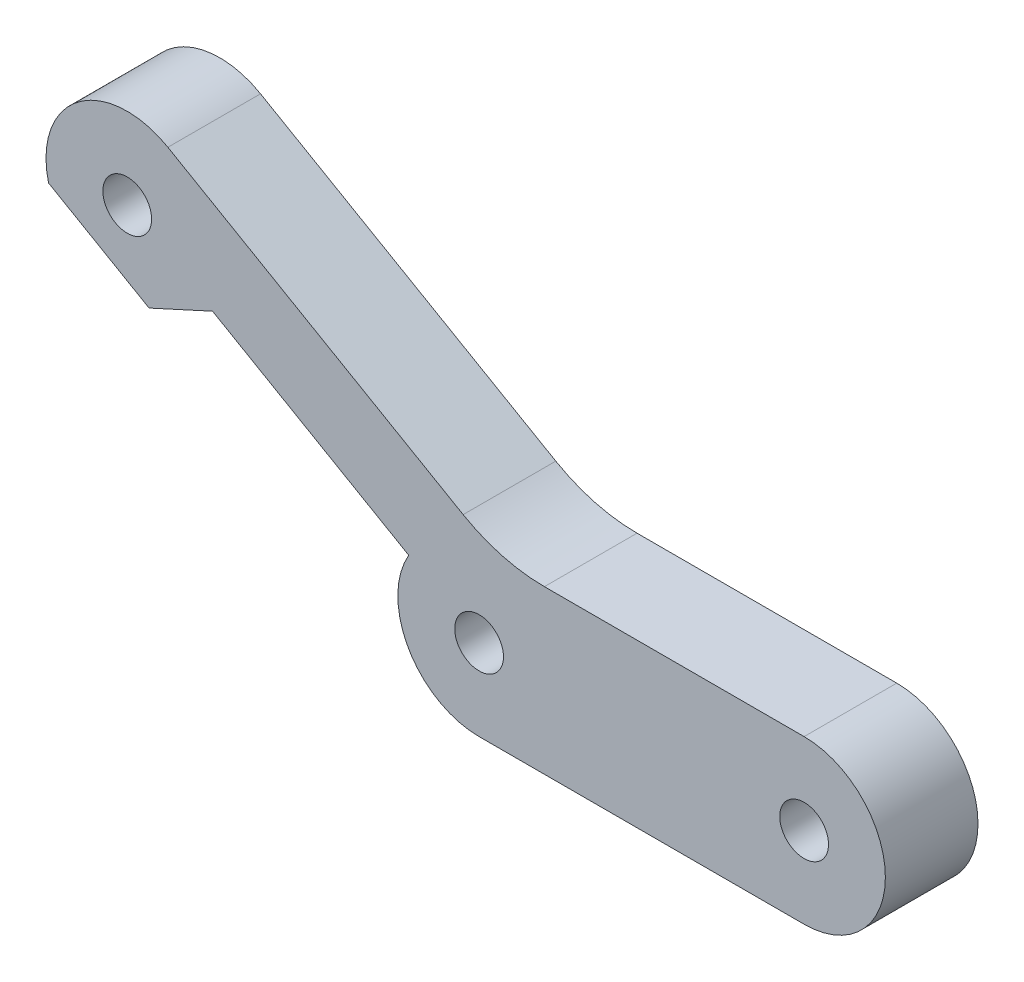
ISO-10303-21;
HEADER;
FILE_DESCRIPTION(('STEP AP214'),'2;1');
FILE_NAME('part.step','',(''),(''),'','','');
FILE_SCHEMA(('AUTOMOTIVE_DESIGN { 1 0 10303 214 1 1 1 1 }'));
ENDSEC;
DATA;
#1=APPLICATION_CONTEXT('core data for automotive mechanical design processes');
#2=APPLICATION_PROTOCOL_DEFINITION('international standard','automotive_design',2000,#1);
#3=PRODUCT_CONTEXT('',#1,'mechanical');
#4=PRODUCT('Part','Part','',(#3));
#5=PRODUCT_RELATED_PRODUCT_CATEGORY('part','',(#4));
#6=PRODUCT_DEFINITION_FORMATION('','',#4);
#7=PRODUCT_DEFINITION_CONTEXT('part definition',#1,'design');
#8=PRODUCT_DEFINITION('design','',#6,#7);
#9=PRODUCT_DEFINITION_SHAPE('','',#8);
#10=(LENGTH_UNIT() NAMED_UNIT(*) SI_UNIT(.MILLI.,.METRE.));
#11=(NAMED_UNIT(*) PLANE_ANGLE_UNIT() SI_UNIT($,.RADIAN.));
#12=(NAMED_UNIT(*) SI_UNIT($,.STERADIAN.) SOLID_ANGLE_UNIT());
#13=UNCERTAINTY_MEASURE_WITH_UNIT(LENGTH_MEASURE(1.E-05),#10,'distance_accuracy_value','');
#14=(GEOMETRIC_REPRESENTATION_CONTEXT(3) GLOBAL_UNCERTAINTY_ASSIGNED_CONTEXT((#13)) GLOBAL_UNIT_ASSIGNED_CONTEXT((#10,
#11,#12)) REPRESENTATION_CONTEXT('',''));
#15=CARTESIAN_POINT('',(0.,0.,0.));
#16=DIRECTION('',(0.,0.,1.));
#17=DIRECTION('',(1.,0.,0.));
#18=AXIS2_PLACEMENT_3D('',#15,#16,#17);
#19=CARTESIAN_POINT('',(0.,5.,5.7));
#20=DIRECTION('',(0.,1.,0.));
#21=DIRECTION('',(-1.,0.,0.));
#22=AXIS2_PLACEMENT_3D('',#19,#20,#21);
#23=PLANE('',#22);
#24=DIRECTION('',(1.,0.,0.));
#25=VECTOR('',#24,1.);
#26=CARTESIAN_POINT('',(0.,5.,0.));
#27=LINE('',#26,#25);
#28=CARTESIAN_POINT('',(-5.98076211353317,5.,0.));
#29=VERTEX_POINT('',#28);
#30=CARTESIAN_POINT('',(10.,5.,0.));
#31=VERTEX_POINT('',#30);
#32=EDGE_CURVE('E168',#29,#31,#27,.T.);
#33=ORIENTED_EDGE('',*,*,#32,.F.);
#34=DIRECTION('',(0.,0.,-1.));
#35=VECTOR('',#34,1.);
#36=CARTESIAN_POINT('',(-5.98076211353317,5.,5.7));
#37=LINE('',#36,#35);
#38=CARTESIAN_POINT('',(-5.98076211353317,5.,5.7));
#39=VERTEX_POINT('',#38);
#40=EDGE_CURVE('E11',#39,#29,#37,.T.);
#41=ORIENTED_EDGE('',*,*,#40,.F.);
#42=DIRECTION('',(1.,0.,0.));
#43=VECTOR('',#42,1.);
#44=CARTESIAN_POINT('',(0.,5.,5.7));
#45=LINE('',#44,#43);
#46=CARTESIAN_POINT('',(10.,5.,5.7));
#47=VERTEX_POINT('',#46);
#48=EDGE_CURVE('E262',#39,#47,#45,.T.);
#49=ORIENTED_EDGE('',*,*,#48,.T.);
#50=DIRECTION('',(0.,0.,-1.));
#51=VECTOR('',#50,1.);
#52=CARTESIAN_POINT('',(10.,5.,5.7));
#53=LINE('',#52,#51);
#54=EDGE_CURVE('E93',#47,#31,#53,.T.);
#55=ORIENTED_EDGE('',*,*,#54,.T.);
#56=EDGE_LOOP('',(#33,#41,#49,#55));
#57=FACE_BOUND('',#56,.T.);
#58=ADVANCED_FACE('F36',(#57),#23,.T.);
#59=CARTESIAN_POINT('',(-5.98076211353321,15.,5.7));
#60=DIRECTION('',(0.,0.,-1.));
#61=DIRECTION('',(-1.,0.,0.));
#62=AXIS2_PLACEMENT_3D('',#59,#60,#61);
#63=CYLINDRICAL_SURFACE('',#62,10.);
#64=CARTESIAN_POINT('',(-5.98076211353321,15.,0.));
#65=DIRECTION('',(0.,0.,1.));
#66=DIRECTION('',(1.,0.,0.));
#67=AXIS2_PLACEMENT_3D('',#64,#65,#66);
#68=CIRCLE('',#67,10.);
#69=CARTESIAN_POINT('',(-10.9807621135332,6.33974596215554,0.));
#70=VERTEX_POINT('',#69);
#71=EDGE_CURVE('E166',#29,#70,#68,.F.);
#72=ORIENTED_EDGE('',*,*,#71,.T.);
#73=DIRECTION('',(0.,0.,-1.));
#74=VECTOR('',#73,1.);
#75=CARTESIAN_POINT('',(-10.9807621135332,6.33974596215554,5.7));
#76=LINE('',#75,#74);
#77=CARTESIAN_POINT('',(-10.9807621135332,6.33974596215554,5.7));
#78=VERTEX_POINT('',#77);
#79=EDGE_CURVE('E45',#78,#70,#76,.T.);
#80=ORIENTED_EDGE('',*,*,#79,.F.);
#81=CARTESIAN_POINT('',(-5.98076211353321,15.,5.7));
#82=DIRECTION('',(0.,0.,1.));
#83=DIRECTION('',(1.,0.,0.));
#84=AXIS2_PLACEMENT_3D('',#81,#82,#83);
#85=CIRCLE('',#84,10.);
#86=EDGE_CURVE('E264',#39,#78,#85,.F.);
#87=ORIENTED_EDGE('',*,*,#86,.F.);
#88=ORIENTED_EDGE('',*,*,#40,.T.);
#89=EDGE_LOOP('',(#72,#80,#87,#88));
#90=FACE_BOUND('',#89,.T.);
#91=ADVANCED_FACE('F167',(#90),#63,.F.);
#92=CARTESIAN_POINT('',(0.,0.,5.7));
#93=DIRECTION('',(-0.499999999999995,-0.866025403784441,0.));
#94=DIRECTION('',(0.866025403784442,-0.499999999999995,0.));
#95=AXIS2_PLACEMENT_3D('',#92,#93,#94);
#96=PLANE('',#95);
#97=DIRECTION('',(-0.866025403784442,0.499999999999995,0.));
#98=VECTOR('',#97,1.);
#99=CARTESIAN_POINT('',(0.,0.,0.));
#100=LINE('',#99,#98);
#101=CARTESIAN_POINT('',(-29.1506350946111,16.830127018922,0.));
#102=VERTEX_POINT('',#101);
#103=EDGE_CURVE('E160',#70,#102,#100,.T.);
#104=ORIENTED_EDGE('',*,*,#103,.T.);
#105=DIRECTION('',(0.,0.,-1.));
#106=VECTOR('',#105,1.);
#107=CARTESIAN_POINT('',(-29.1506350946111,16.830127018922,5.7));
#108=LINE('',#107,#106);
#109=CARTESIAN_POINT('',(-29.1506350946111,16.830127018922,5.7));
#110=VERTEX_POINT('',#109);
#111=EDGE_CURVE('E151',#110,#102,#108,.T.);
#112=ORIENTED_EDGE('',*,*,#111,.F.);
#113=DIRECTION('',(-0.866025403784442,0.499999999999995,0.));
#114=VECTOR('',#113,1.);
#115=CARTESIAN_POINT('',(0.,0.,5.7));
#116=LINE('',#115,#114);
#117=EDGE_CURVE('E162',#78,#110,#116,.T.);
#118=ORIENTED_EDGE('',*,*,#117,.F.);
#119=ORIENTED_EDGE('',*,*,#79,.T.);
#120=EDGE_LOOP('',(#104,#112,#118,#119));
#121=FACE_BOUND('',#120,.T.);
#122=ADVANCED_FACE('F158',(#121),#96,.F.);
#123=CARTESIAN_POINT('',(-31.650635094611,12.4999999999999,5.7));
#124=DIRECTION('',(0.,0.,-1.));
#125=DIRECTION('',(-1.,0.,0.));
#126=AXIS2_PLACEMENT_3D('',#123,#124,#125);
#127=CYLINDRICAL_SURFACE('',#126,5.00000000000001);
#128=CARTESIAN_POINT('',(-31.650635094611,12.4999999999999,0.));
#129=DIRECTION('',(0.,0.,1.));
#130=DIRECTION('',(1.,0.,0.));
#131=AXIS2_PLACEMENT_3D('',#128,#129,#130);
#132=CIRCLE('',#131,5.00000000000001);
#133=CARTESIAN_POINT('',(-36.4929643138243,11.25426819389,0.));
#134=VERTEX_POINT('',#133);
#135=EDGE_CURVE('E170',#102,#134,#132,.T.);
#136=ORIENTED_EDGE('',*,*,#135,.T.);
#137=DIRECTION('',(0.,0.,-1.));
#138=VECTOR('',#137,1.);
#139=CARTESIAN_POINT('',(-36.4929643138243,11.25426819389,5.7));
#140=LINE('',#139,#138);
#141=CARTESIAN_POINT('',(-36.4929643138243,11.25426819389,5.7));
#142=VERTEX_POINT('',#141);
#143=EDGE_CURVE('E149',#142,#134,#140,.T.);
#144=ORIENTED_EDGE('',*,*,#143,.F.);
#145=CARTESIAN_POINT('',(-31.650635094611,12.4999999999999,5.7));
#146=DIRECTION('',(0.,0.,1.));
#147=DIRECTION('',(1.,0.,0.));
#148=AXIS2_PLACEMENT_3D('',#145,#146,#147);
#149=CIRCLE('',#148,5.00000000000001);
#150=EDGE_CURVE('E271',#110,#142,#149,.T.);
#151=ORIENTED_EDGE('',*,*,#150,.F.);
#152=ORIENTED_EDGE('',*,*,#111,.T.);
#153=EDGE_LOOP('',(#136,#144,#151,#152));
#154=FACE_BOUND('',#153,.T.);
#155=ADVANCED_FACE('F224',(#154),#127,.T.);
#156=CARTESIAN_POINT('',(-4.25,-7.36121593216778,5.7));
#157=DIRECTION('',(-0.499999999999997,-0.86602540378444,0.));
#158=DIRECTION('',(0.86602540378444,-0.499999999999997,0.));
#159=AXIS2_PLACEMENT_3D('',#156,#157,#158);
#160=PLANE('',#159);
#161=DIRECTION('',(-0.86602540378444,0.499999999999997,0.));
#162=VECTOR('',#161,1.);
#163=CARTESIAN_POINT('',(-4.25,-7.36121593216778,0.));
#164=LINE('',#163,#162);
#165=CARTESIAN_POINT('',(-30.3083058753978,7.68355397961862,0.));
#166=VERTEX_POINT('',#165);
#167=EDGE_CURVE('E178',#166,#134,#164,.T.);
#168=ORIENTED_EDGE('',*,*,#167,.F.);
#169=DIRECTION('',(0.,0.,-1.));
#170=VECTOR('',#169,1.);
#171=CARTESIAN_POINT('',(-30.3083058753978,7.68355397961862,5.7));
#172=LINE('',#171,#170);
#173=CARTESIAN_POINT('',(-30.3083058753978,7.68355397961862,5.7));
#174=VERTEX_POINT('',#173);
#175=EDGE_CURVE('E147',#174,#166,#172,.T.);
#176=ORIENTED_EDGE('',*,*,#175,.F.);
#177=DIRECTION('',(-0.86602540378444,0.499999999999997,0.));
#178=VECTOR('',#177,1.);
#179=CARTESIAN_POINT('',(-4.25,-7.36121593216778,5.7));
#180=LINE('',#179,#178);
#181=EDGE_CURVE('E273',#174,#142,#180,.T.);
#182=ORIENTED_EDGE('',*,*,#181,.T.);
#183=ORIENTED_EDGE('',*,*,#143,.T.);
#184=EDGE_LOOP('',(#168,#176,#182,#183));
#185=FACE_BOUND('',#184,.T.);
#186=ADVANCED_FACE('F227',(#185),#160,.T.);
#187=CARTESIAN_POINT('',(-8.13835034975614,17.8126794569233,5.7));
#188=DIRECTION('',(-0.415565936172885,0.909563055919024,0.));
#189=DIRECTION('',(-0.909563055919024,-0.415565936172885,0.));
#190=AXIS2_PLACEMENT_3D('',#187,#188,#189);
#191=PLANE('',#190);
#192=DIRECTION('',(0.909563055919024,0.415565936172885,0.));
#193=VECTOR('',#192,1.);
#194=CARTESIAN_POINT('',(-8.13835034975614,17.8126794569233,0.));
#195=LINE('',#194,#193);
#196=CARTESIAN_POINT('',(-26.400635094611,9.46891108675433,0.));
#197=VERTEX_POINT('',#196);
#198=EDGE_CURVE('E181',#166,#197,#195,.T.);
#199=ORIENTED_EDGE('',*,*,#198,.T.);
#200=DIRECTION('',(0.,0.,-1.));
#201=VECTOR('',#200,1.);
#202=CARTESIAN_POINT('',(-26.400635094611,9.46891108675433,5.7));
#203=LINE('',#202,#201);
#204=CARTESIAN_POINT('',(-26.400635094611,9.46891108675433,5.7));
#205=VERTEX_POINT('',#204);
#206=EDGE_CURVE('E141',#205,#197,#203,.T.);
#207=ORIENTED_EDGE('',*,*,#206,.F.);
#208=DIRECTION('',(0.909563055919024,0.415565936172885,0.));
#209=VECTOR('',#208,1.);
#210=CARTESIAN_POINT('',(-8.13835034975614,17.8126794569233,5.7));
#211=LINE('',#210,#209);
#212=EDGE_CURVE('E276',#174,#205,#211,.T.);
#213=ORIENTED_EDGE('',*,*,#212,.F.);
#214=ORIENTED_EDGE('',*,*,#175,.T.);
#215=EDGE_LOOP('',(#199,#207,#213,#214));
#216=FACE_BOUND('',#215,.T.);
#217=ADVANCED_FACE('F231',(#216),#191,.F.);
#218=CARTESIAN_POINT('',(-2.49999999999995,-4.33012701892216,5.7));
#219=DIRECTION('',(-0.499999999999995,-0.866025403784442,0.));
#220=DIRECTION('',(0.866025403784442,-0.499999999999995,0.));
#221=AXIS2_PLACEMENT_3D('',#218,#219,#220);
#222=PLANE('',#221);
#223=DIRECTION('',(-0.866025403784442,0.499999999999995,0.));
#224=VECTOR('',#223,1.);
#225=CARTESIAN_POINT('',(-2.49999999999995,-4.33012701892216,0.));
#226=LINE('',#225,#224);
#227=CARTESIAN_POINT('',(-14.3301270189222,2.49999999999997,0.));
#228=VERTEX_POINT('',#227);
#229=EDGE_CURVE('E184',#228,#197,#226,.T.);
#230=ORIENTED_EDGE('',*,*,#229,.F.);
#231=DIRECTION('',(0.,0.,-1.));
#232=VECTOR('',#231,1.);
#233=CARTESIAN_POINT('',(-14.3301270189222,2.49999999999997,5.7));
#234=LINE('',#233,#232);
#235=CARTESIAN_POINT('',(-14.3301270189222,2.49999999999997,5.7));
#236=VERTEX_POINT('',#235);
#237=EDGE_CURVE('E139',#236,#228,#234,.T.);
#238=ORIENTED_EDGE('',*,*,#237,.F.);
#239=DIRECTION('',(-0.866025403784442,0.499999999999995,0.));
#240=VECTOR('',#239,1.);
#241=CARTESIAN_POINT('',(-2.49999999999995,-4.33012701892216,5.7));
#242=LINE('',#241,#240);
#243=EDGE_CURVE('E133',#236,#205,#242,.T.);
#244=ORIENTED_EDGE('',*,*,#243,.T.);
#245=ORIENTED_EDGE('',*,*,#206,.T.);
#246=EDGE_LOOP('',(#230,#238,#244,#245));
#247=FACE_BOUND('',#246,.T.);
#248=ADVANCED_FACE('F235',(#247),#222,.T.);
#249=CARTESIAN_POINT('',(-10.,0.,5.7));
#250=DIRECTION('',(0.,0.,-1.));
#251=DIRECTION('',(-1.,0.,0.));
#252=AXIS2_PLACEMENT_3D('',#249,#250,#251);
#253=CYLINDRICAL_SURFACE('',#252,5.);
#254=CARTESIAN_POINT('',(-10.,0.,0.));
#255=DIRECTION('',(0.,0.,1.));
#256=DIRECTION('',(1.,0.,0.));
#257=AXIS2_PLACEMENT_3D('',#254,#255,#256);
#258=CIRCLE('',#257,5.);
#259=CARTESIAN_POINT('',(-10.,-5.,0.));
#260=VERTEX_POINT('',#259);
#261=EDGE_CURVE('E138',#228,#260,#258,.T.);
#262=ORIENTED_EDGE('',*,*,#261,.T.);
#263=DIRECTION('',(0.,0.,-1.));
#264=VECTOR('',#263,1.);
#265=CARTESIAN_POINT('',(-10.,-5.,5.7));
#266=LINE('',#265,#264);
#267=CARTESIAN_POINT('',(-10.,-5.,5.7));
#268=VERTEX_POINT('',#267);
#269=EDGE_CURVE('E124',#268,#260,#266,.T.);
#270=ORIENTED_EDGE('',*,*,#269,.F.);
#271=CARTESIAN_POINT('',(-10.,0.,5.7));
#272=DIRECTION('',(0.,0.,1.));
#273=DIRECTION('',(1.,0.,0.));
#274=AXIS2_PLACEMENT_3D('',#271,#272,#273);
#275=CIRCLE('',#274,5.);
#276=EDGE_CURVE('E127',#236,#268,#275,.T.);
#277=ORIENTED_EDGE('',*,*,#276,.F.);
#278=ORIENTED_EDGE('',*,*,#237,.T.);
#279=EDGE_LOOP('',(#262,#270,#277,#278));
#280=FACE_BOUND('',#279,.T.);
#281=ADVANCED_FACE('F136',(#280),#253,.T.);
#282=CARTESIAN_POINT('',(0.,-5.,5.7));
#283=DIRECTION('',(0.,1.,0.));
#284=DIRECTION('',(-1.,0.,0.));
#285=AXIS2_PLACEMENT_3D('',#282,#283,#284);
#286=PLANE('',#285);
#287=DIRECTION('',(1.,0.,0.));
#288=VECTOR('',#287,1.);
#289=CARTESIAN_POINT('',(0.,-5.,0.));
#290=LINE('',#289,#288);
#291=CARTESIAN_POINT('',(10.,-5.,0.));
#292=VERTEX_POINT('',#291);
#293=EDGE_CURVE('E188',#260,#292,#290,.T.);
#294=ORIENTED_EDGE('',*,*,#293,.T.);
#295=DIRECTION('',(0.,0.,-1.));
#296=VECTOR('',#295,1.);
#297=CARTESIAN_POINT('',(10.,-5.,5.7));
#298=LINE('',#297,#296);
#299=CARTESIAN_POINT('',(10.,-5.,5.7));
#300=VERTEX_POINT('',#299);
#301=EDGE_CURVE('E126',#300,#292,#298,.T.);
#302=ORIENTED_EDGE('',*,*,#301,.F.);
#303=DIRECTION('',(1.,0.,0.));
#304=VECTOR('',#303,1.);
#305=CARTESIAN_POINT('',(0.,-5.,5.7));
#306=LINE('',#305,#304);
#307=EDGE_CURVE('E119',#268,#300,#306,.T.);
#308=ORIENTED_EDGE('',*,*,#307,.F.);
#309=ORIENTED_EDGE('',*,*,#269,.T.);
#310=EDGE_LOOP('',(#294,#302,#308,#309));
#311=FACE_BOUND('',#310,.T.);
#312=ADVANCED_FACE('F122',(#311),#286,.F.);
#313=CARTESIAN_POINT('',(-31.650635094611,12.4999999999999,5.7));
#314=DIRECTION('',(0.,0.,-1.));
#315=DIRECTION('',(-1.,0.,0.));
#316=AXIS2_PLACEMENT_3D('',#313,#314,#315);
#317=CYLINDRICAL_SURFACE('',#316,1.5);
#318=CARTESIAN_POINT('',(-31.650635094611,12.4999999999999,5.7));
#319=DIRECTION('',(0.,0.,1.));
#320=DIRECTION('',(1.,0.,0.));
#321=AXIS2_PLACEMENT_3D('',#318,#319,#320);
#322=CIRCLE('',#321,1.5);
#323=CARTESIAN_POINT('',(-30.150635094611,12.4999999999999,5.7));
#324=VERTEX_POINT('',#323);
#325=EDGE_CURVE('E261',#324,#324,#322,.T.);
#326=ORIENTED_EDGE('',*,*,#325,.T.);
#327=EDGE_LOOP('',(#326));
#328=FACE_BOUND('',#327,.T.);
#329=CARTESIAN_POINT('',(-31.650635094611,12.4999999999999,0.));
#330=DIRECTION('',(0.,0.,1.));
#331=DIRECTION('',(1.,0.,0.));
#332=AXIS2_PLACEMENT_3D('',#329,#330,#331);
#333=CIRCLE('',#332,1.5);
#334=CARTESIAN_POINT('',(-30.150635094611,12.4999999999999,0.));
#335=VERTEX_POINT('',#334);
#336=EDGE_CURVE('E172',#335,#335,#333,.T.);
#337=ORIENTED_EDGE('',*,*,#336,.F.);
#338=EDGE_LOOP('',(#337));
#339=FACE_BOUND('',#338,.T.);
#340=ADVANCED_FACE('F203',(#328,#339),#317,.F.);
#341=CARTESIAN_POINT('',(10.,0.,5.7));
#342=DIRECTION('',(0.,0.,-1.));
#343=DIRECTION('',(-1.,0.,0.));
#344=AXIS2_PLACEMENT_3D('',#341,#342,#343);
#345=CYLINDRICAL_SURFACE('',#344,1.5);
#346=CARTESIAN_POINT('',(10.,0.,5.7));
#347=DIRECTION('',(0.,0.,1.));
#348=DIRECTION('',(1.,0.,0.));
#349=AXIS2_PLACEMENT_3D('',#346,#347,#348);
#350=CIRCLE('',#349,1.5);
#351=CARTESIAN_POINT('',(11.5,0.,5.7));
#352=VERTEX_POINT('',#351);
#353=EDGE_CURVE('E259',#352,#352,#350,.T.);
#354=ORIENTED_EDGE('',*,*,#353,.T.);
#355=EDGE_LOOP('',(#354));
#356=FACE_BOUND('',#355,.T.);
#357=CARTESIAN_POINT('',(10.,0.,0.));
#358=DIRECTION('',(0.,0.,1.));
#359=DIRECTION('',(1.,0.,0.));
#360=AXIS2_PLACEMENT_3D('',#357,#358,#359);
#361=CIRCLE('',#360,1.5);
#362=CARTESIAN_POINT('',(11.5,0.,0.));
#363=VERTEX_POINT('',#362);
#364=EDGE_CURVE('E196',#363,#363,#361,.T.);
#365=ORIENTED_EDGE('',*,*,#364,.F.);
#366=EDGE_LOOP('',(#365));
#367=FACE_BOUND('',#366,.T.);
#368=ADVANCED_FACE('F205',(#356,#367),#345,.F.);
#369=CARTESIAN_POINT('',(-10.,0.,5.7));
#370=DIRECTION('',(0.,0.,-1.));
#371=DIRECTION('',(-1.,0.,0.));
#372=AXIS2_PLACEMENT_3D('',#369,#370,#371);
#373=CYLINDRICAL_SURFACE('',#372,1.5);
#374=CARTESIAN_POINT('',(-10.,0.,5.7));
#375=DIRECTION('',(0.,0.,1.));
#376=DIRECTION('',(1.,0.,0.));
#377=AXIS2_PLACEMENT_3D('',#374,#375,#376);
#378=CIRCLE('',#377,1.5);
#379=CARTESIAN_POINT('',(-8.5,0.,5.7));
#380=VERTEX_POINT('',#379);
#381=EDGE_CURVE('E190',#380,#380,#378,.T.);
#382=ORIENTED_EDGE('',*,*,#381,.T.);
#383=EDGE_LOOP('',(#382));
#384=FACE_BOUND('',#383,.T.);
#385=CARTESIAN_POINT('',(-10.,0.,0.));
#386=DIRECTION('',(0.,0.,1.));
#387=DIRECTION('',(1.,0.,0.));
#388=AXIS2_PLACEMENT_3D('',#385,#386,#387);
#389=CIRCLE('',#388,1.5);
#390=CARTESIAN_POINT('',(-8.5,0.,0.));
#391=VERTEX_POINT('',#390);
#392=EDGE_CURVE('E193',#391,#391,#389,.T.);
#393=ORIENTED_EDGE('',*,*,#392,.F.);
#394=EDGE_LOOP('',(#393));
#395=FACE_BOUND('',#394,.T.);
#396=ADVANCED_FACE('F38',(#384,#395),#373,.F.);
#397=CARTESIAN_POINT('',(10.,0.,5.7));
#398=DIRECTION('',(0.,0.,-1.));
#399=DIRECTION('',(-1.,0.,0.));
#400=AXIS2_PLACEMENT_3D('',#397,#398,#399);
#401=CYLINDRICAL_SURFACE('',#400,5.);
#402=CARTESIAN_POINT('',(10.,0.,0.));
#403=DIRECTION('',(0.,0.,1.));
#404=DIRECTION('',(1.,0.,0.));
#405=AXIS2_PLACEMENT_3D('',#402,#403,#404);
#406=CIRCLE('',#405,5.);
#407=EDGE_CURVE('E86',#292,#31,#406,.T.);
#408=ORIENTED_EDGE('',*,*,#407,.T.);
#409=ORIENTED_EDGE('',*,*,#54,.F.);
#410=CARTESIAN_POINT('',(10.,0.,5.7));
#411=DIRECTION('',(0.,0.,1.));
#412=DIRECTION('',(1.,0.,0.));
#413=AXIS2_PLACEMENT_3D('',#410,#411,#412);
#414=CIRCLE('',#413,5.);
#415=EDGE_CURVE('E53',#300,#47,#414,.T.);
#416=ORIENTED_EDGE('',*,*,#415,.F.);
#417=ORIENTED_EDGE('',*,*,#301,.T.);
#418=EDGE_LOOP('',(#408,#409,#416,#417));
#419=FACE_BOUND('',#418,.T.);
#420=ADVANCED_FACE('F242',(#419),#401,.T.);
#421=CARTESIAN_POINT('',(0.,0.,5.7));
#422=DIRECTION('',(0.,0.,1.));
#423=DIRECTION('',(1.,0.,0.));
#424=AXIS2_PLACEMENT_3D('',#421,#422,#423);
#425=PLANE('',#424);
#426=ORIENTED_EDGE('',*,*,#381,.F.);
#427=EDGE_LOOP('',(#426));
#428=FACE_BOUND('',#427,.T.);
#429=ORIENTED_EDGE('',*,*,#353,.F.);
#430=EDGE_LOOP('',(#429));
#431=FACE_BOUND('',#430,.T.);
#432=ORIENTED_EDGE('',*,*,#325,.F.);
#433=EDGE_LOOP('',(#432));
#434=FACE_BOUND('',#433,.T.);
#435=ORIENTED_EDGE('',*,*,#48,.F.);
#436=ORIENTED_EDGE('',*,*,#86,.T.);
#437=ORIENTED_EDGE('',*,*,#117,.T.);
#438=ORIENTED_EDGE('',*,*,#150,.T.);
#439=ORIENTED_EDGE('',*,*,#181,.F.);
#440=ORIENTED_EDGE('',*,*,#212,.T.);
#441=ORIENTED_EDGE('',*,*,#243,.F.);
#442=ORIENTED_EDGE('',*,*,#276,.T.);
#443=ORIENTED_EDGE('',*,*,#307,.T.);
#444=ORIENTED_EDGE('',*,*,#415,.T.);
#445=EDGE_LOOP('',(#435,#436,#437,#438,#439,#440,#441,#442,#443,#444));
#446=FACE_BOUND('',#445,.T.);
#447=ADVANCED_FACE('F131',(#428,#431,#434,#446),#425,.T.);
#448=CARTESIAN_POINT('',(0.,0.,0.));
#449=DIRECTION('',(0.,0.,1.));
#450=DIRECTION('',(1.,0.,0.));
#451=AXIS2_PLACEMENT_3D('',#448,#449,#450);
#452=PLANE('',#451);
#453=ORIENTED_EDGE('',*,*,#392,.T.);
#454=EDGE_LOOP('',(#453));
#455=FACE_BOUND('',#454,.T.);
#456=ORIENTED_EDGE('',*,*,#364,.T.);
#457=EDGE_LOOP('',(#456));
#458=FACE_BOUND('',#457,.T.);
#459=ORIENTED_EDGE('',*,*,#336,.T.);
#460=EDGE_LOOP('',(#459));
#461=FACE_BOUND('',#460,.T.);
#462=ORIENTED_EDGE('',*,*,#32,.T.);
#463=ORIENTED_EDGE('',*,*,#407,.F.);
#464=ORIENTED_EDGE('',*,*,#293,.F.);
#465=ORIENTED_EDGE('',*,*,#261,.F.);
#466=ORIENTED_EDGE('',*,*,#229,.T.);
#467=ORIENTED_EDGE('',*,*,#198,.F.);
#468=ORIENTED_EDGE('',*,*,#167,.T.);
#469=ORIENTED_EDGE('',*,*,#135,.F.);
#470=ORIENTED_EDGE('',*,*,#103,.F.);
#471=ORIENTED_EDGE('',*,*,#71,.F.);
#472=EDGE_LOOP('',(#462,#463,#464,#465,#466,#467,#468,#469,#470,#471));
#473=FACE_BOUND('',#472,.T.);
#474=ADVANCED_FACE('F201',(#455,#458,#461,#473),#452,.F.);
#475=CLOSED_SHELL('',(#58,#91,#122,#155,#186,#217,#248,#281,#312,#340,#368,#396,#420,#447,#474));
#476=MANIFOLD_SOLID_BREP('B2',#475);
#477=ADVANCED_BREP_SHAPE_REPRESENTATION('',(#18,#476),#14);
#478=SHAPE_DEFINITION_REPRESENTATION(#9,#477);
ENDSEC;
END-ISO-10303-21;
